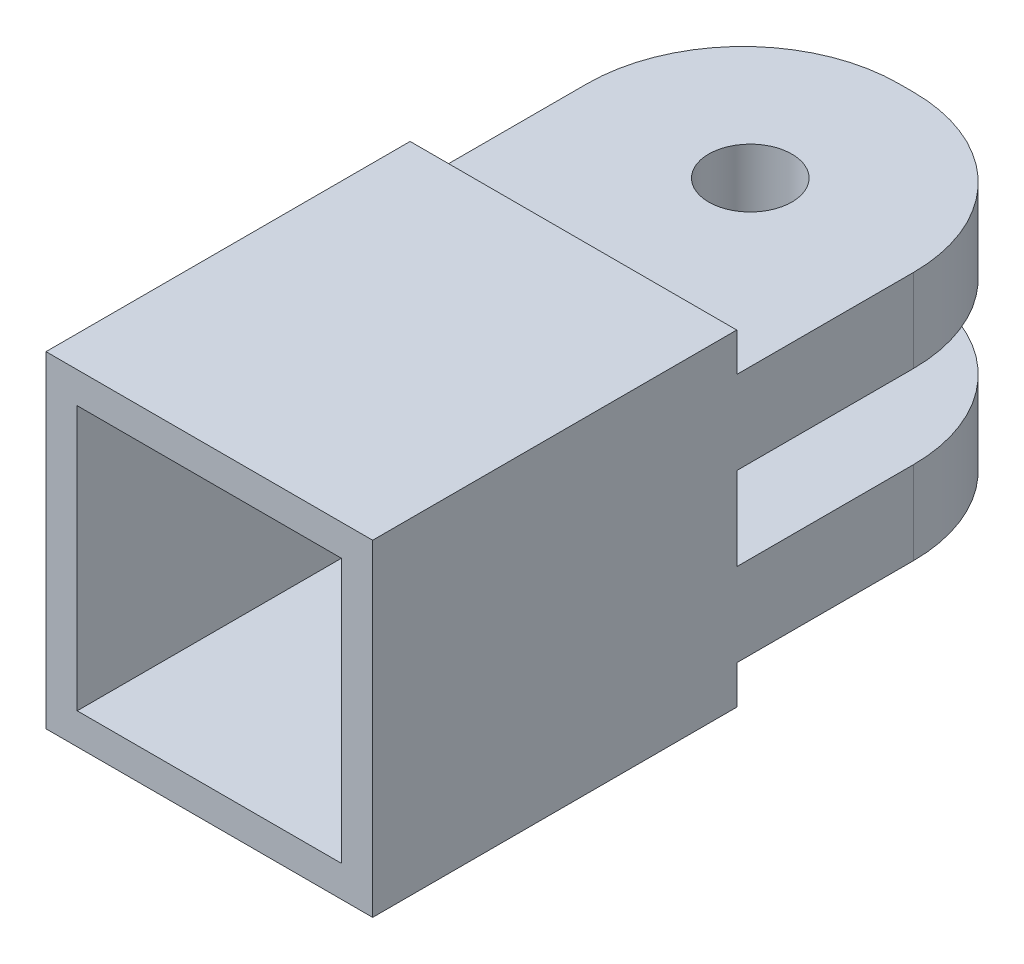
ISO-10303-21;
HEADER;
FILE_DESCRIPTION(('STEP AP214'),'2;1');
FILE_NAME('part.step','',(''),(''),'','','');
FILE_SCHEMA(('AUTOMOTIVE_DESIGN { 1 0 10303 214 1 1 1 1 }'));
ENDSEC;
DATA;
#1=APPLICATION_CONTEXT('core data for automotive mechanical design processes');
#2=APPLICATION_PROTOCOL_DEFINITION('international standard','automotive_design',2000,#1);
#3=PRODUCT_CONTEXT('',#1,'mechanical');
#4=PRODUCT('Part','Part','',(#3));
#5=PRODUCT_RELATED_PRODUCT_CATEGORY('part','',(#4));
#6=PRODUCT_DEFINITION_FORMATION('','',#4);
#7=PRODUCT_DEFINITION_CONTEXT('part definition',#1,'design');
#8=PRODUCT_DEFINITION('design','',#6,#7);
#9=PRODUCT_DEFINITION_SHAPE('','',#8);
#10=(LENGTH_UNIT() NAMED_UNIT(*) SI_UNIT(.MILLI.,.METRE.));
#11=(NAMED_UNIT(*) PLANE_ANGLE_UNIT() SI_UNIT($,.RADIAN.));
#12=(NAMED_UNIT(*) SI_UNIT($,.STERADIAN.) SOLID_ANGLE_UNIT());
#13=UNCERTAINTY_MEASURE_WITH_UNIT(LENGTH_MEASURE(1.E-05),#10,'distance_accuracy_value','');
#14=(GEOMETRIC_REPRESENTATION_CONTEXT(3) GLOBAL_UNCERTAINTY_ASSIGNED_CONTEXT((#13)) GLOBAL_UNIT_ASSIGNED_CONTEXT((#10,
#11,#12)) REPRESENTATION_CONTEXT('',''));
#15=CARTESIAN_POINT('',(0.,0.,0.));
#16=DIRECTION('',(0.,0.,1.));
#17=DIRECTION('',(1.,0.,0.));
#18=AXIS2_PLACEMENT_3D('',#15,#16,#17);
#19=CARTESIAN_POINT('',(0.,0.,-5.));
#20=DIRECTION('',(0.,0.,1.));
#21=DIRECTION('',(1.,0.,0.));
#22=AXIS2_PLACEMENT_3D('',#19,#20,#21);
#23=PLANE('',#22);
#24=DIRECTION('',(0.,1.,0.));
#25=VECTOR('',#24,1.);
#26=CARTESIAN_POINT('',(-15.7,15.7,-5.));
#27=LINE('',#26,#25);
#28=CARTESIAN_POINT('',(-15.7,-15.7,-5.));
#29=VERTEX_POINT('',#28);
#30=CARTESIAN_POINT('',(-15.7,-12.,-5.));
#31=VERTEX_POINT('',#30);
#32=EDGE_CURVE('E55',#29,#31,#27,.T.);
#33=ORIENTED_EDGE('',*,*,#32,.T.);
#34=DIRECTION('',(1.,0.,0.));
#35=VECTOR('',#34,1.);
#36=CARTESIAN_POINT('',(15.7,-12.,-5.));
#37=LINE('',#36,#35);
#38=CARTESIAN_POINT('',(15.7,-12.,-5.));
#39=VERTEX_POINT('',#38);
#40=EDGE_CURVE('E204',#31,#39,#37,.T.);
#41=ORIENTED_EDGE('',*,*,#40,.T.);
#42=DIRECTION('',(0.,-1.,0.));
#43=VECTOR('',#42,1.);
#44=CARTESIAN_POINT('',(15.7,-15.7,-5.));
#45=LINE('',#44,#43);
#46=CARTESIAN_POINT('',(15.7,-15.7,-5.));
#47=VERTEX_POINT('',#46);
#48=EDGE_CURVE('E268',#39,#47,#45,.T.);
#49=ORIENTED_EDGE('',*,*,#48,.T.);
#50=DIRECTION('',(-1.,0.,0.));
#51=VECTOR('',#50,1.);
#52=CARTESIAN_POINT('',(-15.7,-15.7,-5.));
#53=LINE('',#52,#51);
#54=EDGE_CURVE('E271',#47,#29,#53,.T.);
#55=ORIENTED_EDGE('',*,*,#54,.T.);
#56=EDGE_LOOP('',(#33,#41,#49,#55));
#57=FACE_BOUND('',#56,.T.);
#58=ADVANCED_FACE('F32',(#57),#23,.F.);
#59=DIRECTION('',(1.,0.,0.));
#60=VECTOR('',#59,1.);
#61=CARTESIAN_POINT('',(15.7,12.,-5.));
#62=LINE('',#61,#60);
#63=CARTESIAN_POINT('',(-15.7,12.,-5.));
#64=VERTEX_POINT('',#63);
#65=CARTESIAN_POINT('',(15.7,12.,-5.));
#66=VERTEX_POINT('',#65);
#67=EDGE_CURVE('E251',#64,#66,#62,.T.);
#68=ORIENTED_EDGE('',*,*,#67,.F.);
#69=CARTESIAN_POINT('',(-15.7,15.7,-5.));
#70=VERTEX_POINT('',#69);
#71=EDGE_CURVE('E274',#64,#70,#27,.T.);
#72=ORIENTED_EDGE('',*,*,#71,.T.);
#73=DIRECTION('',(1.,0.,0.));
#74=VECTOR('',#73,1.);
#75=CARTESIAN_POINT('',(15.7,15.7,-5.));
#76=LINE('',#75,#74);
#77=CARTESIAN_POINT('',(15.7,15.7,-5.));
#78=VERTEX_POINT('',#77);
#79=EDGE_CURVE('E265',#70,#78,#76,.T.);
#80=ORIENTED_EDGE('',*,*,#79,.T.);
#81=EDGE_CURVE('E269',#78,#66,#45,.T.);
#82=ORIENTED_EDGE('',*,*,#81,.T.);
#83=EDGE_LOOP('',(#68,#72,#80,#82));
#84=FACE_BOUND('',#83,.T.);
#85=ADVANCED_FACE('F370',(#84),#23,.F.);
#86=CARTESIAN_POINT('',(15.7,4.,-5.));
#87=VERTEX_POINT('',#86);
#88=CARTESIAN_POINT('',(15.7,-4.,-5.));
#89=VERTEX_POINT('',#88);
#90=EDGE_CURVE('E272',#87,#89,#45,.T.);
#91=ORIENTED_EDGE('',*,*,#90,.T.);
#92=DIRECTION('',(-1.,0.,0.));
#93=VECTOR('',#92,1.);
#94=CARTESIAN_POINT('',(-15.7,-4.,-5.));
#95=LINE('',#94,#93);
#96=CARTESIAN_POINT('',(-15.7,-4.,-5.));
#97=VERTEX_POINT('',#96);
#98=EDGE_CURVE('E47',#89,#97,#95,.T.);
#99=ORIENTED_EDGE('',*,*,#98,.T.);
#100=CARTESIAN_POINT('',(-15.7,4.,-5.));
#101=VERTEX_POINT('',#100);
#102=EDGE_CURVE('E176',#97,#101,#27,.T.);
#103=ORIENTED_EDGE('',*,*,#102,.T.);
#104=DIRECTION('',(-1.,0.,0.));
#105=VECTOR('',#104,1.);
#106=CARTESIAN_POINT('',(-15.7,4.,-5.));
#107=LINE('',#106,#105);
#108=EDGE_CURVE('E242',#87,#101,#107,.T.);
#109=ORIENTED_EDGE('',*,*,#108,.F.);
#110=EDGE_LOOP('',(#91,#99,#103,#109));
#111=FACE_BOUND('',#110,.T.);
#112=ADVANCED_FACE('F372',(#111),#23,.F.);
#113=CARTESIAN_POINT('',(0.,0.,30.));
#114=DIRECTION('',(0.,0.,1.));
#115=DIRECTION('',(1.,0.,0.));
#116=AXIS2_PLACEMENT_3D('',#113,#114,#115);
#117=PLANE('',#116);
#118=DIRECTION('',(0.,-1.,0.));
#119=VECTOR('',#118,1.);
#120=CARTESIAN_POINT('',(-15.7,15.7,30.));
#121=LINE('',#120,#119);
#122=CARTESIAN_POINT('',(-15.7,15.7,30.));
#123=VERTEX_POINT('',#122);
#124=CARTESIAN_POINT('',(-15.7,-15.7,30.));
#125=VERTEX_POINT('',#124);
#126=EDGE_CURVE('E306',#123,#125,#121,.T.);
#127=ORIENTED_EDGE('',*,*,#126,.T.);
#128=DIRECTION('',(1.,0.,0.));
#129=VECTOR('',#128,1.);
#130=CARTESIAN_POINT('',(-15.7,-15.7,30.));
#131=LINE('',#130,#129);
#132=CARTESIAN_POINT('',(15.7,-15.7,30.));
#133=VERTEX_POINT('',#132);
#134=EDGE_CURVE('E309',#125,#133,#131,.T.);
#135=ORIENTED_EDGE('',*,*,#134,.T.);
#136=DIRECTION('',(0.,1.,0.));
#137=VECTOR('',#136,1.);
#138=CARTESIAN_POINT('',(15.7,15.7,30.));
#139=LINE('',#138,#137);
#140=CARTESIAN_POINT('',(15.7,15.7,30.));
#141=VERTEX_POINT('',#140);
#142=EDGE_CURVE('E311',#133,#141,#139,.T.);
#143=ORIENTED_EDGE('',*,*,#142,.T.);
#144=DIRECTION('',(-1.,0.,0.));
#145=VECTOR('',#144,1.);
#146=CARTESIAN_POINT('',(-15.7,15.7,30.));
#147=LINE('',#146,#145);
#148=EDGE_CURVE('E313',#141,#123,#147,.T.);
#149=ORIENTED_EDGE('',*,*,#148,.T.);
#150=EDGE_LOOP('',(#127,#135,#143,#149));
#151=FACE_BOUND('',#150,.T.);
#152=DIRECTION('',(0.,-1.,0.));
#153=VECTOR('',#152,1.);
#154=CARTESIAN_POINT('',(-12.7,12.7,30.));
#155=LINE('',#154,#153);
#156=CARTESIAN_POINT('',(-12.7,12.7,30.));
#157=VERTEX_POINT('',#156);
#158=CARTESIAN_POINT('',(-12.7,-12.7,30.));
#159=VERTEX_POINT('',#158);
#160=EDGE_CURVE('E279',#157,#159,#155,.T.);
#161=ORIENTED_EDGE('',*,*,#160,.F.);
#162=DIRECTION('',(-1.,0.,0.));
#163=VECTOR('',#162,1.);
#164=CARTESIAN_POINT('',(-12.7,12.7,30.));
#165=LINE('',#164,#163);
#166=CARTESIAN_POINT('',(12.7,12.7,30.));
#167=VERTEX_POINT('',#166);
#168=EDGE_CURVE('E277',#167,#157,#165,.T.);
#169=ORIENTED_EDGE('',*,*,#168,.F.);
#170=DIRECTION('',(0.,1.,0.));
#171=VECTOR('',#170,1.);
#172=CARTESIAN_POINT('',(12.7,12.7,30.));
#173=LINE('',#172,#171);
#174=CARTESIAN_POINT('',(12.7,-12.7,30.));
#175=VERTEX_POINT('',#174);
#176=EDGE_CURVE('E285',#175,#167,#173,.T.);
#177=ORIENTED_EDGE('',*,*,#176,.F.);
#178=DIRECTION('',(1.,0.,0.));
#179=VECTOR('',#178,1.);
#180=CARTESIAN_POINT('',(-12.7,-12.7,30.));
#181=LINE('',#180,#179);
#182=EDGE_CURVE('E282',#159,#175,#181,.T.);
#183=ORIENTED_EDGE('',*,*,#182,.F.);
#184=EDGE_LOOP('',(#161,#169,#177,#183));
#185=FACE_BOUND('',#184,.T.);
#186=ADVANCED_FACE('F380',(#151,#185),#117,.T.);
#187=CARTESIAN_POINT('',(-15.7,15.7,30.));
#188=DIRECTION('',(1.,0.,0.));
#189=DIRECTION('',(0.,1.,0.));
#190=AXIS2_PLACEMENT_3D('',#187,#188,#189);
#191=PLANE('',#190);
#192=DIRECTION('',(0.,0.,-1.));
#193=VECTOR('',#192,1.);
#194=CARTESIAN_POINT('',(-15.7,15.7,30.));
#195=LINE('',#194,#193);
#196=EDGE_CURVE('E315',#123,#70,#195,.T.);
#197=ORIENTED_EDGE('',*,*,#196,.T.);
#198=ORIENTED_EDGE('',*,*,#71,.F.);
#199=DIRECTION('',(0.,0.,1.));
#200=VECTOR('',#199,1.);
#201=CARTESIAN_POINT('',(-15.7,12.,-10.));
#202=LINE('',#201,#200);
#203=CARTESIAN_POINT('',(-15.7,12.,-22.));
#204=VERTEX_POINT('',#203);
#205=EDGE_CURVE('E257',#204,#64,#202,.T.);
#206=ORIENTED_EDGE('',*,*,#205,.F.);
#207=DIRECTION('',(0.,1.,0.));
#208=VECTOR('',#207,1.);
#209=CARTESIAN_POINT('',(-15.7,4.,-22.));
#210=LINE('',#209,#208);
#211=CARTESIAN_POINT('',(-15.7,4.,-22.));
#212=VERTEX_POINT('',#211);
#213=EDGE_CURVE('E239',#212,#204,#210,.T.);
#214=ORIENTED_EDGE('',*,*,#213,.F.);
#215=DIRECTION('',(0.,0.,1.));
#216=VECTOR('',#215,1.);
#217=CARTESIAN_POINT('',(-15.7,4.,-10.));
#218=LINE('',#217,#216);
#219=EDGE_CURVE('E260',#212,#101,#218,.T.);
#220=ORIENTED_EDGE('',*,*,#219,.T.);
#221=ORIENTED_EDGE('',*,*,#102,.F.);
#222=DIRECTION('',(0.,0.,1.));
#223=VECTOR('',#222,1.);
#224=CARTESIAN_POINT('',(-15.7,-4.,-10.));
#225=LINE('',#224,#223);
#226=CARTESIAN_POINT('',(-15.7,-4.,-22.));
#227=VERTEX_POINT('',#226);
#228=EDGE_CURVE('E170',#227,#97,#225,.T.);
#229=ORIENTED_EDGE('',*,*,#228,.F.);
#230=DIRECTION('',(0.,-1.,0.));
#231=VECTOR('',#230,1.);
#232=CARTESIAN_POINT('',(-15.7,-4.,-22.));
#233=LINE('',#232,#231);
#234=CARTESIAN_POINT('',(-15.7,-12.,-22.));
#235=VERTEX_POINT('',#234);
#236=EDGE_CURVE('E174',#227,#235,#233,.T.);
#237=ORIENTED_EDGE('',*,*,#236,.T.);
#238=DIRECTION('',(0.,0.,1.));
#239=VECTOR('',#238,1.);
#240=CARTESIAN_POINT('',(-15.7,-12.,-10.));
#241=LINE('',#240,#239);
#242=EDGE_CURVE('E178',#235,#31,#241,.T.);
#243=ORIENTED_EDGE('',*,*,#242,.T.);
#244=ORIENTED_EDGE('',*,*,#32,.F.);
#245=DIRECTION('',(0.,0.,-1.));
#246=VECTOR('',#245,1.);
#247=CARTESIAN_POINT('',(-15.7,-15.7,30.));
#248=LINE('',#247,#246);
#249=EDGE_CURVE('E11',#125,#29,#248,.T.);
#250=ORIENTED_EDGE('',*,*,#249,.F.);
#251=ORIENTED_EDGE('',*,*,#126,.F.);
#252=EDGE_LOOP('',(#197,#198,#206,#214,#220,#221,#229,#237,#243,#244,#250,#251));
#253=FACE_BOUND('',#252,.T.);
#254=ADVANCED_FACE('F34',(#253),#191,.F.);
#255=CARTESIAN_POINT('',(-15.7,-15.7,30.));
#256=DIRECTION('',(0.,1.,0.));
#257=DIRECTION('',(0.,0.,1.));
#258=AXIS2_PLACEMENT_3D('',#255,#256,#257);
#259=PLANE('',#258);
#260=ORIENTED_EDGE('',*,*,#249,.T.);
#261=ORIENTED_EDGE('',*,*,#54,.F.);
#262=DIRECTION('',(0.,0.,-1.));
#263=VECTOR('',#262,1.);
#264=CARTESIAN_POINT('',(15.7,-15.7,30.));
#265=LINE('',#264,#263);
#266=EDGE_CURVE('E40',#133,#47,#265,.T.);
#267=ORIENTED_EDGE('',*,*,#266,.F.);
#268=ORIENTED_EDGE('',*,*,#134,.F.);
#269=EDGE_LOOP('',(#260,#261,#267,#268));
#270=FACE_BOUND('',#269,.T.);
#271=ADVANCED_FACE('F326',(#270),#259,.F.);
#272=CARTESIAN_POINT('',(15.7,15.7,30.));
#273=DIRECTION('',(-1.,0.,0.));
#274=DIRECTION('',(0.,0.,1.));
#275=AXIS2_PLACEMENT_3D('',#272,#273,#274);
#276=PLANE('',#275);
#277=ORIENTED_EDGE('',*,*,#266,.T.);
#278=ORIENTED_EDGE('',*,*,#48,.F.);
#279=DIRECTION('',(0.,0.,1.));
#280=VECTOR('',#279,1.);
#281=CARTESIAN_POINT('',(15.7,-12.,-10.));
#282=LINE('',#281,#280);
#283=CARTESIAN_POINT('',(15.7,-12.,-22.));
#284=VERTEX_POINT('',#283);
#285=EDGE_CURVE('E211',#284,#39,#282,.T.);
#286=ORIENTED_EDGE('',*,*,#285,.F.);
#287=DIRECTION('',(0.,-1.,0.));
#288=VECTOR('',#287,1.);
#289=CARTESIAN_POINT('',(15.7,-4.,-22.));
#290=LINE('',#289,#288);
#291=CARTESIAN_POINT('',(15.7,-4.,-22.));
#292=VERTEX_POINT('',#291);
#293=EDGE_CURVE('E206',#292,#284,#290,.T.);
#294=ORIENTED_EDGE('',*,*,#293,.F.);
#295=DIRECTION('',(0.,0.,1.));
#296=VECTOR('',#295,1.);
#297=CARTESIAN_POINT('',(15.7,-4.,-10.));
#298=LINE('',#297,#296);
#299=EDGE_CURVE('E179',#292,#89,#298,.T.);
#300=ORIENTED_EDGE('',*,*,#299,.T.);
#301=ORIENTED_EDGE('',*,*,#90,.F.);
#302=DIRECTION('',(0.,0.,1.));
#303=VECTOR('',#302,1.);
#304=CARTESIAN_POINT('',(15.7,4.,-10.));
#305=LINE('',#304,#303);
#306=CARTESIAN_POINT('',(15.7,4.,-22.));
#307=VERTEX_POINT('',#306);
#308=EDGE_CURVE('E262',#307,#87,#305,.T.);
#309=ORIENTED_EDGE('',*,*,#308,.F.);
#310=DIRECTION('',(0.,1.,0.));
#311=VECTOR('',#310,1.);
#312=CARTESIAN_POINT('',(15.7,4.,-22.));
#313=LINE('',#312,#311);
#314=CARTESIAN_POINT('',(15.7,12.,-22.));
#315=VERTEX_POINT('',#314);
#316=EDGE_CURVE('E231',#307,#315,#313,.T.);
#317=ORIENTED_EDGE('',*,*,#316,.T.);
#318=DIRECTION('',(0.,0.,1.));
#319=VECTOR('',#318,1.);
#320=CARTESIAN_POINT('',(15.7,12.,-10.));
#321=LINE('',#320,#319);
#322=EDGE_CURVE('E254',#315,#66,#321,.T.);
#323=ORIENTED_EDGE('',*,*,#322,.T.);
#324=ORIENTED_EDGE('',*,*,#81,.F.);
#325=DIRECTION('',(0.,0.,-1.));
#326=VECTOR('',#325,1.);
#327=CARTESIAN_POINT('',(15.7,15.7,30.));
#328=LINE('',#327,#326);
#329=EDGE_CURVE('E317',#141,#78,#328,.T.);
#330=ORIENTED_EDGE('',*,*,#329,.F.);
#331=ORIENTED_EDGE('',*,*,#142,.F.);
#332=EDGE_LOOP('',(#277,#278,#286,#294,#300,#301,#309,#317,#323,#324,#330,#331));
#333=FACE_BOUND('',#332,.T.);
#334=ADVANCED_FACE('F323',(#333),#276,.F.);
#335=CARTESIAN_POINT('',(-15.7,15.7,30.));
#336=DIRECTION('',(0.,-1.,0.));
#337=DIRECTION('',(0.,0.,-1.));
#338=AXIS2_PLACEMENT_3D('',#335,#336,#337);
#339=PLANE('',#338);
#340=ORIENTED_EDGE('',*,*,#329,.T.);
#341=ORIENTED_EDGE('',*,*,#79,.F.);
#342=ORIENTED_EDGE('',*,*,#196,.F.);
#343=ORIENTED_EDGE('',*,*,#148,.F.);
#344=EDGE_LOOP('',(#340,#341,#342,#343));
#345=FACE_BOUND('',#344,.T.);
#346=ADVANCED_FACE('F433',(#345),#339,.F.);
#347=CARTESIAN_POINT('',(-12.7,12.7,30.));
#348=DIRECTION('',(0.,-1.,0.));
#349=DIRECTION('',(0.,0.,-1.));
#350=AXIS2_PLACEMENT_3D('',#347,#348,#349);
#351=PLANE('',#350);
#352=DIRECTION('',(-1.,0.,0.));
#353=VECTOR('',#352,1.);
#354=CARTESIAN_POINT('',(-12.7,12.7,0.));
#355=LINE('',#354,#353);
#356=CARTESIAN_POINT('',(12.7,12.7,0.));
#357=VERTEX_POINT('',#356);
#358=CARTESIAN_POINT('',(-12.7,12.7,0.));
#359=VERTEX_POINT('',#358);
#360=EDGE_CURVE('E276',#357,#359,#355,.T.);
#361=ORIENTED_EDGE('',*,*,#360,.F.);
#362=DIRECTION('',(0.,0.,-1.));
#363=VECTOR('',#362,1.);
#364=CARTESIAN_POINT('',(12.7,12.7,30.));
#365=LINE('',#364,#363);
#366=EDGE_CURVE('E287',#167,#357,#365,.T.);
#367=ORIENTED_EDGE('',*,*,#366,.F.);
#368=ORIENTED_EDGE('',*,*,#168,.T.);
#369=DIRECTION('',(0.,0.,-1.));
#370=VECTOR('',#369,1.);
#371=CARTESIAN_POINT('',(-12.7,12.7,30.));
#372=LINE('',#371,#370);
#373=EDGE_CURVE('E303',#157,#359,#372,.T.);
#374=ORIENTED_EDGE('',*,*,#373,.T.);
#375=EDGE_LOOP('',(#361,#367,#368,#374));
#376=FACE_BOUND('',#375,.T.);
#377=ADVANCED_FACE('F560',(#376),#351,.T.);
#378=CARTESIAN_POINT('',(-12.7,12.7,30.));
#379=DIRECTION('',(1.,0.,0.));
#380=DIRECTION('',(0.,1.,0.));
#381=AXIS2_PLACEMENT_3D('',#378,#379,#380);
#382=PLANE('',#381);
#383=DIRECTION('',(0.,-1.,0.));
#384=VECTOR('',#383,1.);
#385=CARTESIAN_POINT('',(-12.7,12.7,0.));
#386=LINE('',#385,#384);
#387=CARTESIAN_POINT('',(-12.7,-12.7,0.));
#388=VERTEX_POINT('',#387);
#389=EDGE_CURVE('E290',#359,#388,#386,.T.);
#390=ORIENTED_EDGE('',*,*,#389,.F.);
#391=ORIENTED_EDGE('',*,*,#373,.F.);
#392=ORIENTED_EDGE('',*,*,#160,.T.);
#393=DIRECTION('',(0.,0.,-1.));
#394=VECTOR('',#393,1.);
#395=CARTESIAN_POINT('',(-12.7,-12.7,30.));
#396=LINE('',#395,#394);
#397=EDGE_CURVE('E301',#159,#388,#396,.T.);
#398=ORIENTED_EDGE('',*,*,#397,.T.);
#399=EDGE_LOOP('',(#390,#391,#392,#398));
#400=FACE_BOUND('',#399,.T.);
#401=ADVANCED_FACE('F550',(#400),#382,.T.);
#402=CARTESIAN_POINT('',(-12.7,-12.7,30.));
#403=DIRECTION('',(0.,1.,0.));
#404=DIRECTION('',(-1.,0.,0.));
#405=AXIS2_PLACEMENT_3D('',#402,#403,#404);
#406=PLANE('',#405);
#407=DIRECTION('',(1.,0.,0.));
#408=VECTOR('',#407,1.);
#409=CARTESIAN_POINT('',(-12.7,-12.7,0.));
#410=LINE('',#409,#408);
#411=CARTESIAN_POINT('',(12.7,-12.7,0.));
#412=VERTEX_POINT('',#411);
#413=EDGE_CURVE('E293',#388,#412,#410,.T.);
#414=ORIENTED_EDGE('',*,*,#413,.F.);
#415=ORIENTED_EDGE('',*,*,#397,.F.);
#416=ORIENTED_EDGE('',*,*,#182,.T.);
#417=DIRECTION('',(0.,0.,-1.));
#418=VECTOR('',#417,1.);
#419=CARTESIAN_POINT('',(12.7,-12.7,30.));
#420=LINE('',#419,#418);
#421=EDGE_CURVE('E299',#175,#412,#420,.T.);
#422=ORIENTED_EDGE('',*,*,#421,.T.);
#423=EDGE_LOOP('',(#414,#415,#416,#422));
#424=FACE_BOUND('',#423,.T.);
#425=ADVANCED_FACE('F539',(#424),#406,.T.);
#426=CARTESIAN_POINT('',(12.7,12.7,30.));
#427=DIRECTION('',(-1.,0.,0.));
#428=DIRECTION('',(0.,-1.,0.));
#429=AXIS2_PLACEMENT_3D('',#426,#427,#428);
#430=PLANE('',#429);
#431=DIRECTION('',(0.,1.,0.));
#432=VECTOR('',#431,1.);
#433=CARTESIAN_POINT('',(12.7,12.7,0.));
#434=LINE('',#433,#432);
#435=EDGE_CURVE('E280',#412,#357,#434,.T.);
#436=ORIENTED_EDGE('',*,*,#435,.F.);
#437=ORIENTED_EDGE('',*,*,#421,.F.);
#438=ORIENTED_EDGE('',*,*,#176,.T.);
#439=ORIENTED_EDGE('',*,*,#366,.T.);
#440=EDGE_LOOP('',(#436,#437,#438,#439));
#441=FACE_BOUND('',#440,.T.);
#442=ADVANCED_FACE('F529',(#441),#430,.T.);
#443=CARTESIAN_POINT('',(0.,0.,0.));
#444=DIRECTION('',(0.,0.,1.));
#445=DIRECTION('',(1.,0.,0.));
#446=AXIS2_PLACEMENT_3D('',#443,#444,#445);
#447=PLANE('',#446);
#448=ORIENTED_EDGE('',*,*,#435,.T.);
#449=ORIENTED_EDGE('',*,*,#360,.T.);
#450=ORIENTED_EDGE('',*,*,#389,.T.);
#451=ORIENTED_EDGE('',*,*,#413,.T.);
#452=EDGE_LOOP('',(#448,#449,#450,#451));
#453=FACE_BOUND('',#452,.T.);
#454=ADVANCED_FACE('F513',(#453),#447,.T.);
#455=CARTESIAN_POINT('',(-15.7,4.,-10.));
#456=DIRECTION('',(0.,1.,0.));
#457=DIRECTION('',(-1.,0.,0.));
#458=AXIS2_PLACEMENT_3D('',#455,#456,#457);
#459=PLANE('',#458);
#460=ORIENTED_EDGE('',*,*,#108,.T.);
#461=ORIENTED_EDGE('',*,*,#219,.F.);
#462=CARTESIAN_POINT('',(-0.699999999999992,4.,-22.));
#463=DIRECTION('',(0.,1.,0.));
#464=DIRECTION('',(0.,0.,-1.));
#465=AXIS2_PLACEMENT_3D('',#462,#463,#464);
#466=CIRCLE('',#465,15.);
#467=CARTESIAN_POINT('',(-0.699999999999992,4.,-37.));
#468=VERTEX_POINT('',#467);
#469=EDGE_CURVE('E228',#468,#212,#466,.T.);
#470=ORIENTED_EDGE('',*,*,#469,.F.);
#471=DIRECTION('',(-1.,0.,0.));
#472=VECTOR('',#471,1.);
#473=CARTESIAN_POINT('',(0.699999999999994,4.,-37.));
#474=LINE('',#473,#472);
#475=CARTESIAN_POINT('',(0.699999999999994,4.,-37.));
#476=VERTEX_POINT('',#475);
#477=EDGE_CURVE('E224',#476,#468,#474,.T.);
#478=ORIENTED_EDGE('',*,*,#477,.F.);
#479=CARTESIAN_POINT('',(0.699999999999996,4.,-22.));
#480=DIRECTION('',(0.,1.,0.));
#481=DIRECTION('',(0.,0.,-1.));
#482=AXIS2_PLACEMENT_3D('',#479,#480,#481);
#483=CIRCLE('',#482,15.);
#484=EDGE_CURVE('E221',#307,#476,#483,.T.);
#485=ORIENTED_EDGE('',*,*,#484,.F.);
#486=ORIENTED_EDGE('',*,*,#308,.T.);
#487=EDGE_LOOP('',(#460,#461,#470,#478,#485,#486));
#488=FACE_BOUND('',#487,.T.);
#489=CARTESIAN_POINT('',(0.,4.,-22.));
#490=DIRECTION('',(0.,1.,0.));
#491=DIRECTION('',(0.,0.,1.));
#492=AXIS2_PLACEMENT_3D('',#489,#490,#491);
#493=CIRCLE('',#492,4.);
#494=CARTESIAN_POINT('',(0.,4.,-18.));
#495=VERTEX_POINT('',#494);
#496=EDGE_CURVE('E215',#495,#495,#493,.T.);
#497=ORIENTED_EDGE('',*,*,#496,.T.);
#498=EDGE_LOOP('',(#497));
#499=FACE_BOUND('',#498,.T.);
#500=ADVANCED_FACE('F502',(#488,#499),#459,.F.);
#501=CARTESIAN_POINT('',(15.7,12.,-10.));
#502=DIRECTION('',(0.,-1.,0.));
#503=DIRECTION('',(0.,0.,-1.));
#504=AXIS2_PLACEMENT_3D('',#501,#502,#503);
#505=PLANE('',#504);
#506=ORIENTED_EDGE('',*,*,#67,.T.);
#507=ORIENTED_EDGE('',*,*,#322,.F.);
#508=CARTESIAN_POINT('',(0.699999999999996,12.,-22.));
#509=DIRECTION('',(0.,1.,0.));
#510=DIRECTION('',(0.,0.,-1.));
#511=AXIS2_PLACEMENT_3D('',#508,#509,#510);
#512=CIRCLE('',#511,15.);
#513=CARTESIAN_POINT('',(0.699999999999994,12.,-37.));
#514=VERTEX_POINT('',#513);
#515=EDGE_CURVE('E218',#315,#514,#512,.T.);
#516=ORIENTED_EDGE('',*,*,#515,.T.);
#517=DIRECTION('',(-1.,0.,0.));
#518=VECTOR('',#517,1.);
#519=CARTESIAN_POINT('',(0.699999999999994,12.,-37.));
#520=LINE('',#519,#518);
#521=CARTESIAN_POINT('',(-0.699999999999992,12.,-37.));
#522=VERTEX_POINT('',#521);
#523=EDGE_CURVE('E234',#514,#522,#520,.T.);
#524=ORIENTED_EDGE('',*,*,#523,.T.);
#525=CARTESIAN_POINT('',(-0.699999999999992,12.,-22.));
#526=DIRECTION('',(0.,1.,0.));
#527=DIRECTION('',(0.,0.,-1.));
#528=AXIS2_PLACEMENT_3D('',#525,#526,#527);
#529=CIRCLE('',#528,15.);
#530=EDGE_CURVE('E225',#522,#204,#529,.T.);
#531=ORIENTED_EDGE('',*,*,#530,.T.);
#532=ORIENTED_EDGE('',*,*,#205,.T.);
#533=EDGE_LOOP('',(#506,#507,#516,#524,#531,#532));
#534=FACE_BOUND('',#533,.T.);
#535=CARTESIAN_POINT('',(0.,12.,-22.));
#536=DIRECTION('',(0.,1.,0.));
#537=DIRECTION('',(0.,0.,1.));
#538=AXIS2_PLACEMENT_3D('',#535,#536,#537);
#539=CIRCLE('',#538,4.);
#540=CARTESIAN_POINT('',(0.,12.,-18.));
#541=VERTEX_POINT('',#540);
#542=EDGE_CURVE('E214',#541,#541,#539,.T.);
#543=ORIENTED_EDGE('',*,*,#542,.F.);
#544=EDGE_LOOP('',(#543));
#545=FACE_BOUND('',#544,.T.);
#546=ADVANCED_FACE('F492',(#534,#545),#505,.F.);
#547=CARTESIAN_POINT('',(-0.699999999999992,4.,-22.));
#548=DIRECTION('',(0.,1.,0.));
#549=DIRECTION('',(0.,0.,1.));
#550=AXIS2_PLACEMENT_3D('',#547,#548,#549);
#551=CYLINDRICAL_SURFACE('',#550,15.);
#552=ORIENTED_EDGE('',*,*,#530,.F.);
#553=DIRECTION('',(0.,1.,0.));
#554=VECTOR('',#553,1.);
#555=CARTESIAN_POINT('',(-0.699999999999992,4.,-37.));
#556=LINE('',#555,#554);
#557=EDGE_CURVE('E243',#468,#522,#556,.T.);
#558=ORIENTED_EDGE('',*,*,#557,.F.);
#559=ORIENTED_EDGE('',*,*,#469,.T.);
#560=ORIENTED_EDGE('',*,*,#213,.T.);
#561=EDGE_LOOP('',(#552,#558,#559,#560));
#562=FACE_BOUND('',#561,.T.);
#563=ADVANCED_FACE('F482',(#562),#551,.T.);
#564=CARTESIAN_POINT('',(0.699999999999994,4.,-37.));
#565=DIRECTION('',(0.,0.,-1.));
#566=DIRECTION('',(-1.,0.,0.));
#567=AXIS2_PLACEMENT_3D('',#564,#565,#566);
#568=PLANE('',#567);
#569=ORIENTED_EDGE('',*,*,#523,.F.);
#570=DIRECTION('',(0.,1.,0.));
#571=VECTOR('',#570,1.);
#572=CARTESIAN_POINT('',(0.699999999999994,4.,-37.));
#573=LINE('',#572,#571);
#574=EDGE_CURVE('E245',#476,#514,#573,.T.);
#575=ORIENTED_EDGE('',*,*,#574,.F.);
#576=ORIENTED_EDGE('',*,*,#477,.T.);
#577=ORIENTED_EDGE('',*,*,#557,.T.);
#578=EDGE_LOOP('',(#569,#575,#576,#577));
#579=FACE_BOUND('',#578,.T.);
#580=ADVANCED_FACE('F472',(#579),#568,.T.);
#581=CARTESIAN_POINT('',(0.699999999999996,4.,-22.));
#582=DIRECTION('',(0.,1.,0.));
#583=DIRECTION('',(0.,0.,1.));
#584=AXIS2_PLACEMENT_3D('',#581,#582,#583);
#585=CYLINDRICAL_SURFACE('',#584,15.);
#586=ORIENTED_EDGE('',*,*,#515,.F.);
#587=ORIENTED_EDGE('',*,*,#316,.F.);
#588=ORIENTED_EDGE('',*,*,#484,.T.);
#589=ORIENTED_EDGE('',*,*,#574,.T.);
#590=EDGE_LOOP('',(#586,#587,#588,#589));
#591=FACE_BOUND('',#590,.T.);
#592=ADVANCED_FACE('F462',(#591),#585,.T.);
#593=CARTESIAN_POINT('',(0.,4.,-22.));
#594=DIRECTION('',(0.,1.,0.));
#595=DIRECTION('',(0.,0.,1.));
#596=AXIS2_PLACEMENT_3D('',#593,#594,#595);
#597=CYLINDRICAL_SURFACE('',#596,4.);
#598=ORIENTED_EDGE('',*,*,#496,.F.);
#599=EDGE_LOOP('',(#598));
#600=FACE_BOUND('',#599,.T.);
#601=ORIENTED_EDGE('',*,*,#542,.T.);
#602=EDGE_LOOP('',(#601));
#603=FACE_BOUND('',#602,.T.);
#604=ADVANCED_FACE('F366',(#600,#603),#597,.F.);
#605=CARTESIAN_POINT('',(15.7,-12.,-10.));
#606=DIRECTION('',(0.,-1.,0.));
#607=DIRECTION('',(0.,0.,-1.));
#608=AXIS2_PLACEMENT_3D('',#605,#606,#607);
#609=PLANE('',#608);
#610=ORIENTED_EDGE('',*,*,#40,.F.);
#611=ORIENTED_EDGE('',*,*,#242,.F.);
#612=CARTESIAN_POINT('',(-0.699999999999992,-12.,-22.));
#613=DIRECTION('',(0.,1.,0.));
#614=DIRECTION('',(0.,0.,-1.));
#615=AXIS2_PLACEMENT_3D('',#612,#613,#614);
#616=CIRCLE('',#615,15.);
#617=CARTESIAN_POINT('',(-0.699999999999992,-12.,-37.));
#618=VERTEX_POINT('',#617);
#619=EDGE_CURVE('E195',#618,#235,#616,.T.);
#620=ORIENTED_EDGE('',*,*,#619,.F.);
#621=DIRECTION('',(-1.,0.,0.));
#622=VECTOR('',#621,1.);
#623=CARTESIAN_POINT('',(0.699999999999994,-12.,-37.));
#624=LINE('',#623,#622);
#625=CARTESIAN_POINT('',(0.699999999999994,-12.,-37.));
#626=VERTEX_POINT('',#625);
#627=EDGE_CURVE('E345',#626,#618,#624,.T.);
#628=ORIENTED_EDGE('',*,*,#627,.F.);
#629=CARTESIAN_POINT('',(0.699999999999996,-12.,-22.));
#630=DIRECTION('',(0.,1.,0.));
#631=DIRECTION('',(0.,0.,-1.));
#632=AXIS2_PLACEMENT_3D('',#629,#630,#631);
#633=CIRCLE('',#632,15.);
#634=EDGE_CURVE('E190',#284,#626,#633,.T.);
#635=ORIENTED_EDGE('',*,*,#634,.F.);
#636=ORIENTED_EDGE('',*,*,#285,.T.);
#637=EDGE_LOOP('',(#610,#611,#620,#628,#635,#636));
#638=FACE_BOUND('',#637,.T.);
#639=CARTESIAN_POINT('',(0.,-12.,-22.));
#640=DIRECTION('',(0.,1.,0.));
#641=DIRECTION('',(0.,0.,1.));
#642=AXIS2_PLACEMENT_3D('',#639,#640,#641);
#643=CIRCLE('',#642,4.);
#644=CARTESIAN_POINT('',(0.,-12.,-18.));
#645=VERTEX_POINT('',#644);
#646=EDGE_CURVE('E350',#645,#645,#643,.T.);
#647=ORIENTED_EDGE('',*,*,#646,.T.);
#648=EDGE_LOOP('',(#647));
#649=FACE_BOUND('',#648,.T.);
#650=ADVANCED_FACE('F331',(#638,#649),#609,.T.);
#651=CARTESIAN_POINT('',(-15.7,-4.,-10.));
#652=DIRECTION('',(0.,1.,0.));
#653=DIRECTION('',(-1.,0.,0.));
#654=AXIS2_PLACEMENT_3D('',#651,#652,#653);
#655=PLANE('',#654);
#656=ORIENTED_EDGE('',*,*,#98,.F.);
#657=ORIENTED_EDGE('',*,*,#299,.F.);
#658=CARTESIAN_POINT('',(0.699999999999996,-4.,-22.));
#659=DIRECTION('',(0.,1.,0.));
#660=DIRECTION('',(0.,0.,-1.));
#661=AXIS2_PLACEMENT_3D('',#658,#659,#660);
#662=CIRCLE('',#661,15.);
#663=CARTESIAN_POINT('',(0.699999999999994,-4.,-37.));
#664=VERTEX_POINT('',#663);
#665=EDGE_CURVE('E197',#292,#664,#662,.T.);
#666=ORIENTED_EDGE('',*,*,#665,.T.);
#667=DIRECTION('',(-1.,0.,0.));
#668=VECTOR('',#667,1.);
#669=CARTESIAN_POINT('',(0.699999999999994,-4.,-37.));
#670=LINE('',#669,#668);
#671=CARTESIAN_POINT('',(-0.699999999999992,-4.,-37.));
#672=VERTEX_POINT('',#671);
#673=EDGE_CURVE('E186',#664,#672,#670,.T.);
#674=ORIENTED_EDGE('',*,*,#673,.T.);
#675=CARTESIAN_POINT('',(-0.699999999999992,-4.,-22.));
#676=DIRECTION('',(0.,1.,0.));
#677=DIRECTION('',(0.,0.,-1.));
#678=AXIS2_PLACEMENT_3D('',#675,#676,#677);
#679=CIRCLE('',#678,15.);
#680=EDGE_CURVE('E182',#672,#227,#679,.T.);
#681=ORIENTED_EDGE('',*,*,#680,.T.);
#682=ORIENTED_EDGE('',*,*,#228,.T.);
#683=EDGE_LOOP('',(#656,#657,#666,#674,#681,#682));
#684=FACE_BOUND('',#683,.T.);
#685=CARTESIAN_POINT('',(0.,-4.,-22.));
#686=DIRECTION('',(0.,1.,0.));
#687=DIRECTION('',(0.,0.,1.));
#688=AXIS2_PLACEMENT_3D('',#685,#686,#687);
#689=CIRCLE('',#688,4.);
#690=CARTESIAN_POINT('',(0.,-4.,-18.));
#691=VERTEX_POINT('',#690);
#692=EDGE_CURVE('E347',#691,#691,#689,.T.);
#693=ORIENTED_EDGE('',*,*,#692,.F.);
#694=EDGE_LOOP('',(#693));
#695=FACE_BOUND('',#694,.T.);
#696=ADVANCED_FACE('F183',(#684,#695),#655,.T.);
#697=CARTESIAN_POINT('',(0.699999999999996,-4.,-22.));
#698=DIRECTION('',(0.,-1.,0.));
#699=DIRECTION('',(0.,0.,-1.));
#700=AXIS2_PLACEMENT_3D('',#697,#698,#699);
#701=CYLINDRICAL_SURFACE('',#700,15.);
#702=ORIENTED_EDGE('',*,*,#634,.T.);
#703=DIRECTION('',(0.,-1.,0.));
#704=VECTOR('',#703,1.);
#705=CARTESIAN_POINT('',(0.699999999999994,-4.,-37.));
#706=LINE('',#705,#704);
#707=EDGE_CURVE('E199',#664,#626,#706,.T.);
#708=ORIENTED_EDGE('',*,*,#707,.F.);
#709=ORIENTED_EDGE('',*,*,#665,.F.);
#710=ORIENTED_EDGE('',*,*,#293,.T.);
#711=EDGE_LOOP('',(#702,#708,#709,#710));
#712=FACE_BOUND('',#711,.T.);
#713=ADVANCED_FACE('F339',(#712),#701,.T.);
#714=CARTESIAN_POINT('',(0.699999999999994,-4.,-37.));
#715=DIRECTION('',(0.,0.,1.));
#716=DIRECTION('',(1.,0.,0.));
#717=AXIS2_PLACEMENT_3D('',#714,#715,#716);
#718=PLANE('',#717);
#719=ORIENTED_EDGE('',*,*,#627,.T.);
#720=DIRECTION('',(0.,-1.,0.));
#721=VECTOR('',#720,1.);
#722=CARTESIAN_POINT('',(-0.699999999999992,-4.,-37.));
#723=LINE('',#722,#721);
#724=EDGE_CURVE('E196',#672,#618,#723,.T.);
#725=ORIENTED_EDGE('',*,*,#724,.F.);
#726=ORIENTED_EDGE('',*,*,#673,.F.);
#727=ORIENTED_EDGE('',*,*,#707,.T.);
#728=EDGE_LOOP('',(#719,#725,#726,#727));
#729=FACE_BOUND('',#728,.T.);
#730=ADVANCED_FACE('F364',(#729),#718,.F.);
#731=CARTESIAN_POINT('',(-0.699999999999992,-4.,-22.));
#732=DIRECTION('',(0.,-1.,0.));
#733=DIRECTION('',(0.,0.,-1.));
#734=AXIS2_PLACEMENT_3D('',#731,#732,#733);
#735=CYLINDRICAL_SURFACE('',#734,15.);
#736=ORIENTED_EDGE('',*,*,#619,.T.);
#737=ORIENTED_EDGE('',*,*,#236,.F.);
#738=ORIENTED_EDGE('',*,*,#680,.F.);
#739=ORIENTED_EDGE('',*,*,#724,.T.);
#740=EDGE_LOOP('',(#736,#737,#738,#739));
#741=FACE_BOUND('',#740,.T.);
#742=ADVANCED_FACE('F193',(#741),#735,.T.);
#743=CARTESIAN_POINT('',(0.,-4.,-22.));
#744=DIRECTION('',(0.,-1.,0.));
#745=DIRECTION('',(0.,0.,-1.));
#746=AXIS2_PLACEMENT_3D('',#743,#744,#745);
#747=CYLINDRICAL_SURFACE('',#746,4.);
#748=ORIENTED_EDGE('',*,*,#692,.T.);
#749=EDGE_LOOP('',(#748));
#750=FACE_BOUND('',#749,.T.);
#751=ORIENTED_EDGE('',*,*,#646,.F.);
#752=EDGE_LOOP('',(#751));
#753=FACE_BOUND('',#752,.T.);
#754=ADVANCED_FACE('F356',(#750,#753),#747,.F.);
#755=CLOSED_SHELL('',(#58,#85,#112,#186,#254,#271,#334,#346,#377,#401,#425,#442,#454,#500,#546,
#563,#580,#592,#604,#650,#696,#713,#730,#742,#754));
#756=MANIFOLD_SOLID_BREP('B2',#755);
#757=ADVANCED_BREP_SHAPE_REPRESENTATION('',(#18,#756),#14);
#758=SHAPE_DEFINITION_REPRESENTATION(#9,#757);
ENDSEC;
END-ISO-10303-21;
